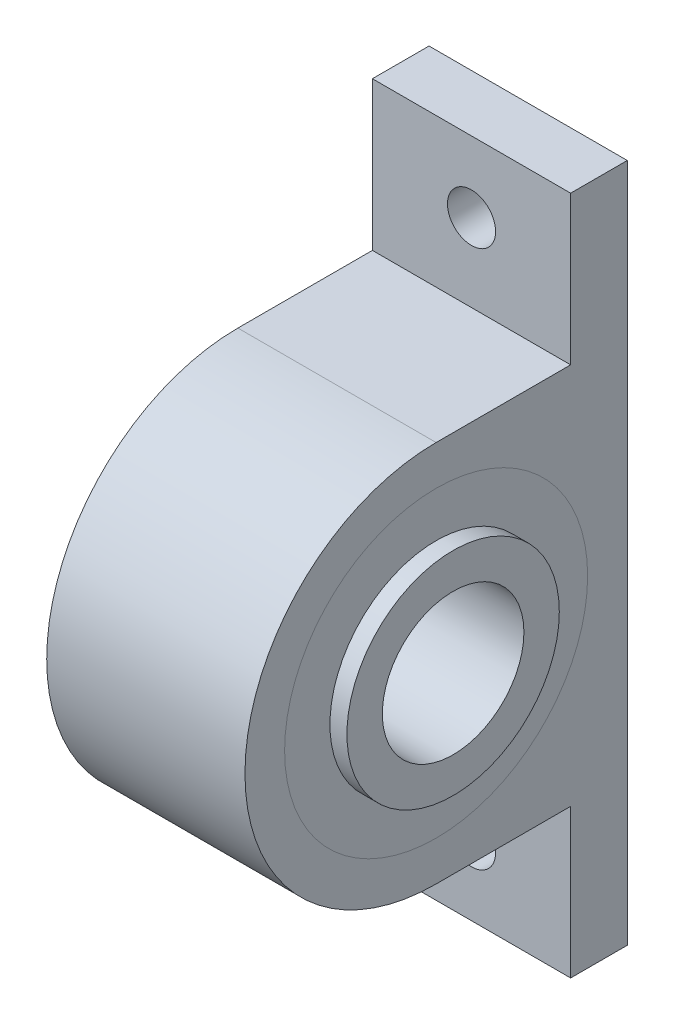
ISO-10303-21;
HEADER;
FILE_DESCRIPTION(('STEP AP214'),'2;1');
FILE_NAME('part.step','',(''),(''),'','','');
FILE_SCHEMA(('AUTOMOTIVE_DESIGN { 1 0 10303 214 1 1 1 1 }'));
ENDSEC;
DATA;
#1=APPLICATION_CONTEXT('core data for automotive mechanical design processes');
#2=APPLICATION_PROTOCOL_DEFINITION('international standard','automotive_design',2000,#1);
#3=PRODUCT_CONTEXT('',#1,'mechanical');
#4=PRODUCT('Part','Part','',(#3));
#5=PRODUCT_RELATED_PRODUCT_CATEGORY('part','',(#4));
#6=PRODUCT_DEFINITION_FORMATION('','',#4);
#7=PRODUCT_DEFINITION_CONTEXT('part definition',#1,'design');
#8=PRODUCT_DEFINITION('design','',#6,#7);
#9=PRODUCT_DEFINITION_SHAPE('','',#8);
#10=(LENGTH_UNIT() NAMED_UNIT(*) SI_UNIT(.MILLI.,.METRE.));
#11=(NAMED_UNIT(*) PLANE_ANGLE_UNIT() SI_UNIT($,.RADIAN.));
#12=(NAMED_UNIT(*) SI_UNIT($,.STERADIAN.) SOLID_ANGLE_UNIT());
#13=UNCERTAINTY_MEASURE_WITH_UNIT(LENGTH_MEASURE(1.E-05),#10,'distance_accuracy_value','');
#14=(GEOMETRIC_REPRESENTATION_CONTEXT(3) GLOBAL_UNCERTAINTY_ASSIGNED_CONTEXT((#13)) GLOBAL_UNIT_ASSIGNED_CONTEXT((#10,
#11,#12)) REPRESENTATION_CONTEXT('',''));
#15=CARTESIAN_POINT('',(0.,0.,0.));
#16=DIRECTION('',(0.,0.,1.));
#17=DIRECTION('',(1.,0.,0.));
#18=AXIS2_PLACEMENT_3D('',#15,#16,#17);
#19=CARTESIAN_POINT('',(-44.9999999999999,0.,67.5));
#20=DIRECTION('',(1.,0.,0.));
#21=DIRECTION('',(0.,0.,-1.));
#22=AXIS2_PLACEMENT_3D('',#19,#20,#21);
#23=CYLINDRICAL_SURFACE('',#22,37.5);
#24=CARTESIAN_POINT('',(-44.9999999999999,0.,67.5));
#25=DIRECTION('',(1.,0.,0.));
#26=DIRECTION('',(0.,0.,-1.));
#27=AXIS2_PLACEMENT_3D('',#24,#25,#26);
#28=CIRCLE('',#27,37.5);
#29=CARTESIAN_POINT('',(-44.9999999999999,0.,30.));
#30=VERTEX_POINT('',#29);
#31=EDGE_CURVE('E11',#30,#30,#28,.T.);
#32=ORIENTED_EDGE('',*,*,#31,.T.);
#33=EDGE_LOOP('',(#32));
#34=FACE_BOUND('',#33,.T.);
#35=CARTESIAN_POINT('',(40.9999999999999,0.,67.5));
#36=DIRECTION('',(1.,0.,0.));
#37=DIRECTION('',(0.,0.,-1.));
#38=AXIS2_PLACEMENT_3D('',#35,#36,#37);
#39=CIRCLE('',#38,37.5);
#40=CARTESIAN_POINT('',(40.9999999999999,0.,30.));
#41=VERTEX_POINT('',#40);
#42=EDGE_CURVE('E49',#41,#41,#39,.T.);
#43=ORIENTED_EDGE('',*,*,#42,.F.);
#44=EDGE_LOOP('',(#43));
#45=FACE_BOUND('',#44,.T.);
#46=ADVANCED_FACE('F39',(#34,#45),#23,.T.);
#47=CARTESIAN_POINT('',(-44.9999999999999,0.,67.5));
#48=DIRECTION('',(1.,0.,0.));
#49=DIRECTION('',(0.,0.,-1.));
#50=AXIS2_PLACEMENT_3D('',#47,#48,#49);
#51=PLANE('',#50);
#52=CARTESIAN_POINT('',(-44.9999999999999,0.,67.5));
#53=DIRECTION('',(1.,0.,0.));
#54=DIRECTION('',(0.,0.,-1.));
#55=AXIS2_PLACEMENT_3D('',#52,#53,#54);
#56=CIRCLE('',#55,25.);
#57=CARTESIAN_POINT('',(-44.9999999999999,0.,42.5));
#58=VERTEX_POINT('',#57);
#59=EDGE_CURVE('E45',#58,#58,#56,.T.);
#60=ORIENTED_EDGE('',*,*,#59,.T.);
#61=EDGE_LOOP('',(#60));
#62=FACE_BOUND('',#61,.T.);
#63=ORIENTED_EDGE('',*,*,#31,.F.);
#64=EDGE_LOOP('',(#63));
#65=FACE_BOUND('',#64,.T.);
#66=ADVANCED_FACE('F68',(#62,#65),#51,.F.);
#67=CARTESIAN_POINT('',(-44.9999999999999,0.,67.5));
#68=DIRECTION('',(1.,0.,0.));
#69=DIRECTION('',(0.,0.,-1.));
#70=AXIS2_PLACEMENT_3D('',#67,#68,#69);
#71=CYLINDRICAL_SURFACE('',#70,25.);
#72=ORIENTED_EDGE('',*,*,#59,.F.);
#73=EDGE_LOOP('',(#72));
#74=FACE_BOUND('',#73,.T.);
#75=CARTESIAN_POINT('',(40.9999999999999,0.,67.5));
#76=DIRECTION('',(1.,0.,0.));
#77=DIRECTION('',(0.,0.,-1.));
#78=AXIS2_PLACEMENT_3D('',#75,#76,#77);
#79=CIRCLE('',#78,25.);
#80=CARTESIAN_POINT('',(40.9999999999999,0.,42.5));
#81=VERTEX_POINT('',#80);
#82=EDGE_CURVE('E53',#81,#81,#79,.T.);
#83=ORIENTED_EDGE('',*,*,#82,.T.);
#84=EDGE_LOOP('',(#83));
#85=FACE_BOUND('',#84,.T.);
#86=ADVANCED_FACE('F59',(#74,#85),#71,.F.);
#87=CARTESIAN_POINT('',(40.9999999999999,0.,67.5));
#88=DIRECTION('',(1.,0.,0.));
#89=DIRECTION('',(0.,0.,-1.));
#90=AXIS2_PLACEMENT_3D('',#87,#88,#89);
#91=PLANE('',#90);
#92=ORIENTED_EDGE('',*,*,#42,.T.);
#93=EDGE_LOOP('',(#92));
#94=FACE_BOUND('',#93,.T.);
#95=ORIENTED_EDGE('',*,*,#82,.F.);
#96=EDGE_LOOP('',(#95));
#97=FACE_BOUND('',#96,.T.);
#98=ADVANCED_FACE('F61',(#94,#97),#91,.T.);
#99=CLOSED_SHELL('',(#46,#66,#86,#98));
#100=MANIFOLD_SOLID_BREP('B2',#99);
#101=CARTESIAN_POINT('',(-186.320851173921,0.,67.5));
#102=DIRECTION('',(1.,0.,0.));
#103=DIRECTION('',(0.,0.,-1.));
#104=AXIS2_PLACEMENT_3D('',#101,#102,#103);
#105=CYLINDRICAL_SURFACE('',#104,53.5);
#106=CARTESIAN_POINT('',(-35.,0.,67.5));
#107=DIRECTION('',(1.,0.,0.));
#108=DIRECTION('',(0.,0.,-1.));
#109=AXIS2_PLACEMENT_3D('',#106,#107,#108);
#110=CIRCLE('',#109,53.5);
#111=CARTESIAN_POINT('',(-35.,0.,14.));
#112=VERTEX_POINT('',#111);
#113=EDGE_CURVE('E115',#112,#112,#110,.F.);
#114=ORIENTED_EDGE('',*,*,#113,.F.);
#115=EDGE_LOOP('',(#114));
#116=FACE_BOUND('',#115,.T.);
#117=CARTESIAN_POINT('',(35.,0.,67.5));
#118=DIRECTION('',(1.,0.,0.));
#119=DIRECTION('',(0.,0.,-1.));
#120=AXIS2_PLACEMENT_3D('',#117,#118,#119);
#121=CIRCLE('',#120,53.5);
#122=CARTESIAN_POINT('',(35.,0.,14.));
#123=VERTEX_POINT('',#122);
#124=EDGE_CURVE('E119',#123,#123,#121,.T.);
#125=ORIENTED_EDGE('',*,*,#124,.F.);
#126=EDGE_LOOP('',(#125));
#127=FACE_BOUND('',#126,.T.);
#128=ADVANCED_FACE('F109',(#116,#127),#105,.T.);
#129=CARTESIAN_POINT('',(35.,0.,67.5));
#130=DIRECTION('',(1.,0.,0.));
#131=DIRECTION('',(0.,0.,-1.));
#132=AXIS2_PLACEMENT_3D('',#129,#130,#131);
#133=PLANE('',#132);
#134=CARTESIAN_POINT('',(35.,0.,67.5));
#135=DIRECTION('',(1.,0.,0.));
#136=DIRECTION('',(0.,0.,-1.));
#137=AXIS2_PLACEMENT_3D('',#134,#135,#136);
#138=CIRCLE('',#137,37.5);
#139=CARTESIAN_POINT('',(35.,0.,30.));
#140=VERTEX_POINT('',#139);
#141=EDGE_CURVE('E124',#140,#140,#138,.T.);
#142=ORIENTED_EDGE('',*,*,#141,.F.);
#143=EDGE_LOOP('',(#142));
#144=FACE_BOUND('',#143,.T.);
#145=ORIENTED_EDGE('',*,*,#124,.T.);
#146=EDGE_LOOP('',(#145));
#147=FACE_BOUND('',#146,.T.);
#148=ADVANCED_FACE('F131',(#144,#147),#133,.T.);
#149=CARTESIAN_POINT('',(-186.320851173921,0.,67.5));
#150=DIRECTION('',(1.,0.,0.));
#151=DIRECTION('',(0.,0.,-1.));
#152=AXIS2_PLACEMENT_3D('',#149,#150,#151);
#153=CYLINDRICAL_SURFACE('',#152,37.5);
#154=CARTESIAN_POINT('',(-35.,0.,67.5));
#155=DIRECTION('',(1.,0.,0.));
#156=DIRECTION('',(0.,0.,-1.));
#157=AXIS2_PLACEMENT_3D('',#154,#155,#156);
#158=CIRCLE('',#157,37.5);
#159=CARTESIAN_POINT('',(-35.,0.,30.));
#160=VERTEX_POINT('',#159);
#161=EDGE_CURVE('E38',#160,#160,#158,.F.);
#162=ORIENTED_EDGE('',*,*,#161,.T.);
#163=EDGE_LOOP('',(#162));
#164=FACE_BOUND('',#163,.T.);
#165=ORIENTED_EDGE('',*,*,#141,.T.);
#166=EDGE_LOOP('',(#165));
#167=FACE_BOUND('',#166,.T.);
#168=ADVANCED_FACE('F129',(#164,#167),#153,.F.);
#169=CARTESIAN_POINT('',(-35.,-120.,20.));
#170=DIRECTION('',(1.,0.,0.));
#171=DIRECTION('',(0.,0.,-1.));
#172=AXIS2_PLACEMENT_3D('',#169,#170,#171);
#173=PLANE('',#172);
#174=ORIENTED_EDGE('',*,*,#113,.T.);
#175=EDGE_LOOP('',(#174));
#176=FACE_BOUND('',#175,.T.);
#177=ORIENTED_EDGE('',*,*,#161,.F.);
#178=EDGE_LOOP('',(#177));
#179=FACE_BOUND('',#178,.T.);
#180=ADVANCED_FACE('F150',(#176,#179),#173,.F.);
#181=CLOSED_SHELL('',(#128,#148,#168,#180));
#182=MANIFOLD_SOLID_BREP('B6',#181);
#183=CARTESIAN_POINT('',(0.,0.,20.));
#184=DIRECTION('',(0.,0.,-1.));
#185=DIRECTION('',(-1.,0.,0.));
#186=AXIS2_PLACEMENT_3D('',#183,#184,#185);
#187=PLANE('',#186);
#188=CARTESIAN_POINT('',(0.,-95.,20.));
#189=DIRECTION('',(0.,0.,1.));
#190=DIRECTION('',(1.,0.,0.));
#191=AXIS2_PLACEMENT_3D('',#188,#189,#190);
#192=CIRCLE('',#191,8.5);
#193=CARTESIAN_POINT('',(8.5,-95.,20.));
#194=VERTEX_POINT('',#193);
#195=EDGE_CURVE('E289',#194,#194,#192,.T.);
#196=ORIENTED_EDGE('',*,*,#195,.F.);
#197=EDGE_LOOP('',(#196));
#198=FACE_BOUND('',#197,.T.);
#199=DIRECTION('',(-1.,0.,0.));
#200=VECTOR('',#199,1.);
#201=CARTESIAN_POINT('',(86.362704791783,-67.5,20.));
#202=LINE('',#201,#200);
#203=CARTESIAN_POINT('',(35.,-67.5,20.));
#204=VERTEX_POINT('',#203);
#205=CARTESIAN_POINT('',(-35.,-67.5,20.));
#206=VERTEX_POINT('',#205);
#207=EDGE_CURVE('E241',#204,#206,#202,.T.);
#208=ORIENTED_EDGE('',*,*,#207,.T.);
#209=DIRECTION('',(0.,-1.,0.));
#210=VECTOR('',#209,1.);
#211=CARTESIAN_POINT('',(-35.,-120.,20.));
#212=LINE('',#211,#210);
#213=CARTESIAN_POINT('',(-35.,-120.,20.));
#214=VERTEX_POINT('',#213);
#215=EDGE_CURVE('E251',#206,#214,#212,.T.);
#216=ORIENTED_EDGE('',*,*,#215,.T.);
#217=DIRECTION('',(1.,0.,0.));
#218=VECTOR('',#217,1.);
#219=CARTESIAN_POINT('',(-35.,-120.,20.));
#220=LINE('',#219,#218);
#221=CARTESIAN_POINT('',(35.,-120.,20.));
#222=VERTEX_POINT('',#221);
#223=EDGE_CURVE('E263',#214,#222,#220,.T.);
#224=ORIENTED_EDGE('',*,*,#223,.T.);
#225=DIRECTION('',(0.,1.,0.));
#226=VECTOR('',#225,1.);
#227=CARTESIAN_POINT('',(35.,-120.,20.));
#228=LINE('',#227,#226);
#229=EDGE_CURVE('E254',#222,#204,#228,.T.);
#230=ORIENTED_EDGE('',*,*,#229,.T.);
#231=EDGE_LOOP('',(#208,#216,#224,#230));
#232=FACE_BOUND('',#231,.T.);
#233=ADVANCED_FACE('F170',(#198,#232),#187,.F.);
#234=CARTESIAN_POINT('',(225.918830920368,0.,67.5));
#235=DIRECTION('',(-1.,0.,0.));
#236=DIRECTION('',(0.,0.,1.));
#237=AXIS2_PLACEMENT_3D('',#234,#235,#236);
#238=CYLINDRICAL_SURFACE('',#237,67.5);
#239=CARTESIAN_POINT('',(35.,0.,67.5));
#240=DIRECTION('',(-1.,0.,0.));
#241=DIRECTION('',(0.,0.,1.));
#242=AXIS2_PLACEMENT_3D('',#239,#240,#241);
#243=CIRCLE('',#242,67.5);
#244=CARTESIAN_POINT('',(35.,-67.5,67.4999999999993));
#245=VERTEX_POINT('',#244);
#246=CARTESIAN_POINT('',(35.,67.5,67.5));
#247=VERTEX_POINT('',#246);
#248=EDGE_CURVE('E187',#245,#247,#243,.T.);
#249=ORIENTED_EDGE('',*,*,#248,.T.);
#250=DIRECTION('',(-1.,0.,0.));
#251=VECTOR('',#250,1.);
#252=CARTESIAN_POINT('',(86.362704791783,67.5,67.5000000000002));
#253=LINE('',#252,#251);
#254=CARTESIAN_POINT('',(-35.,67.5,67.5));
#255=VERTEX_POINT('',#254);
#256=EDGE_CURVE('E304',#247,#255,#253,.T.);
#257=ORIENTED_EDGE('',*,*,#256,.T.);
#258=CARTESIAN_POINT('',(-35.,0.,67.5));
#259=DIRECTION('',(1.,0.,0.));
#260=DIRECTION('',(0.,0.,-1.));
#261=AXIS2_PLACEMENT_3D('',#258,#259,#260);
#262=CIRCLE('',#261,67.5);
#263=CARTESIAN_POINT('',(-35.,-67.5,67.5));
#264=VERTEX_POINT('',#263);
#265=EDGE_CURVE('E309',#264,#255,#262,.F.);
#266=ORIENTED_EDGE('',*,*,#265,.F.);
#267=DIRECTION('',(-1.,0.,0.));
#268=VECTOR('',#267,1.);
#269=CARTESIAN_POINT('',(86.362704791783,-67.5,67.4999999999993));
#270=LINE('',#269,#268);
#271=EDGE_CURVE('E243',#245,#264,#270,.T.);
#272=ORIENTED_EDGE('',*,*,#271,.F.);
#273=EDGE_LOOP('',(#249,#257,#266,#272));
#274=FACE_BOUND('',#273,.T.);
#275=ADVANCED_FACE('F333',(#274),#238,.T.);
#276=CARTESIAN_POINT('',(0.,95.,20.));
#277=DIRECTION('',(0.,0.,1.));
#278=DIRECTION('',(1.,0.,0.));
#279=AXIS2_PLACEMENT_3D('',#276,#277,#278);
#280=CIRCLE('',#279,8.50000000000001);
#281=CARTESIAN_POINT('',(8.50000000000001,95.,20.));
#282=VERTEX_POINT('',#281);
#283=EDGE_CURVE('E299',#282,#282,#280,.T.);
#284=ORIENTED_EDGE('',*,*,#283,.F.);
#285=EDGE_LOOP('',(#284));
#286=FACE_BOUND('',#285,.T.);
#287=CARTESIAN_POINT('',(-35.,120.,20.));
#288=VERTEX_POINT('',#287);
#289=CARTESIAN_POINT('',(-35.,67.5,20.));
#290=VERTEX_POINT('',#289);
#291=EDGE_CURVE('E260',#288,#290,#212,.T.);
#292=ORIENTED_EDGE('',*,*,#291,.T.);
#293=DIRECTION('',(-1.,0.,0.));
#294=VECTOR('',#293,1.);
#295=CARTESIAN_POINT('',(86.362704791783,67.5,20.));
#296=LINE('',#295,#294);
#297=CARTESIAN_POINT('',(35.,67.5,20.));
#298=VERTEX_POINT('',#297);
#299=EDGE_CURVE('E195',#298,#290,#296,.T.);
#300=ORIENTED_EDGE('',*,*,#299,.F.);
#301=CARTESIAN_POINT('',(35.,120.,20.));
#302=VERTEX_POINT('',#301);
#303=EDGE_CURVE('E277',#298,#302,#228,.T.);
#304=ORIENTED_EDGE('',*,*,#303,.T.);
#305=DIRECTION('',(-1.,0.,0.));
#306=VECTOR('',#305,1.);
#307=CARTESIAN_POINT('',(-35.,120.,20.));
#308=LINE('',#307,#306);
#309=EDGE_CURVE('E261',#302,#288,#308,.T.);
#310=ORIENTED_EDGE('',*,*,#309,.T.);
#311=EDGE_LOOP('',(#292,#300,#304,#310));
#312=FACE_BOUND('',#311,.T.);
#313=ADVANCED_FACE('F314',(#286,#312),#187,.F.);
#314=CARTESIAN_POINT('',(35.,-120.,20.));
#315=DIRECTION('',(-1.,0.,0.));
#316=DIRECTION('',(0.,0.,1.));
#317=AXIS2_PLACEMENT_3D('',#314,#315,#316);
#318=PLANE('',#317);
#319=CARTESIAN_POINT('',(35.,0.,67.5));
#320=DIRECTION('',(1.,0.,0.));
#321=DIRECTION('',(0.,0.,-1.));
#322=AXIS2_PLACEMENT_3D('',#319,#320,#321);
#323=CIRCLE('',#322,53.5);
#324=CARTESIAN_POINT('',(35.,0.,14.));
#325=VERTEX_POINT('',#324);
#326=EDGE_CURVE('E286',#325,#325,#323,.T.);
#327=ORIENTED_EDGE('',*,*,#326,.F.);
#328=EDGE_LOOP('',(#327));
#329=FACE_BOUND('',#328,.T.);
#330=DIRECTION('',(0.,0.,1.));
#331=VECTOR('',#330,1.);
#332=CARTESIAN_POINT('',(35.,-67.5,0.));
#333=LINE('',#332,#331);
#334=EDGE_CURVE('E308',#204,#245,#333,.T.);
#335=ORIENTED_EDGE('',*,*,#334,.F.);
#336=ORIENTED_EDGE('',*,*,#229,.F.);
#337=DIRECTION('',(0.,0.,-1.));
#338=VECTOR('',#337,1.);
#339=CARTESIAN_POINT('',(35.,-120.,20.));
#340=LINE('',#339,#338);
#341=CARTESIAN_POINT('',(35.,-120.,0.));
#342=VERTEX_POINT('',#341);
#343=EDGE_CURVE('E268',#222,#342,#340,.T.);
#344=ORIENTED_EDGE('',*,*,#343,.T.);
#345=DIRECTION('',(0.,1.,0.));
#346=VECTOR('',#345,1.);
#347=CARTESIAN_POINT('',(35.,-120.,0.));
#348=LINE('',#347,#346);
#349=CARTESIAN_POINT('',(35.,120.,0.));
#350=VERTEX_POINT('',#349);
#351=EDGE_CURVE('E269',#342,#350,#348,.T.);
#352=ORIENTED_EDGE('',*,*,#351,.T.);
#353=DIRECTION('',(0.,0.,-1.));
#354=VECTOR('',#353,1.);
#355=CARTESIAN_POINT('',(35.,120.,20.));
#356=LINE('',#355,#354);
#357=EDGE_CURVE('E107',#302,#350,#356,.T.);
#358=ORIENTED_EDGE('',*,*,#357,.F.);
#359=ORIENTED_EDGE('',*,*,#303,.F.);
#360=DIRECTION('',(0.,0.,1.));
#361=VECTOR('',#360,1.);
#362=CARTESIAN_POINT('',(35.,67.5,0.));
#363=LINE('',#362,#361);
#364=EDGE_CURVE('E248',#298,#247,#363,.T.);
#365=ORIENTED_EDGE('',*,*,#364,.T.);
#366=ORIENTED_EDGE('',*,*,#248,.F.);
#367=EDGE_LOOP('',(#335,#336,#344,#352,#358,#359,#365,#366));
#368=FACE_BOUND('',#367,.T.);
#369=ADVANCED_FACE('F172',(#329,#368),#318,.F.);
#370=CARTESIAN_POINT('',(-35.,120.,20.));
#371=DIRECTION('',(0.,-1.,0.));
#372=DIRECTION('',(0.,0.,-1.));
#373=AXIS2_PLACEMENT_3D('',#370,#371,#372);
#374=PLANE('',#373);
#375=DIRECTION('',(-1.,0.,0.));
#376=VECTOR('',#375,1.);
#377=CARTESIAN_POINT('',(-35.,120.,0.));
#378=LINE('',#377,#376);
#379=CARTESIAN_POINT('',(-35.,120.,0.));
#380=VERTEX_POINT('',#379);
#381=EDGE_CURVE('E271',#350,#380,#378,.T.);
#382=ORIENTED_EDGE('',*,*,#381,.T.);
#383=DIRECTION('',(0.,0.,-1.));
#384=VECTOR('',#383,1.);
#385=CARTESIAN_POINT('',(-35.,120.,20.));
#386=LINE('',#385,#384);
#387=EDGE_CURVE('E179',#288,#380,#386,.T.);
#388=ORIENTED_EDGE('',*,*,#387,.F.);
#389=ORIENTED_EDGE('',*,*,#309,.F.);
#390=ORIENTED_EDGE('',*,*,#357,.T.);
#391=EDGE_LOOP('',(#382,#388,#389,#390));
#392=FACE_BOUND('',#391,.T.);
#393=ADVANCED_FACE('F320',(#392),#374,.F.);
#394=CARTESIAN_POINT('',(-35.,-120.,20.));
#395=DIRECTION('',(1.,0.,0.));
#396=DIRECTION('',(0.,0.,-1.));
#397=AXIS2_PLACEMENT_3D('',#394,#395,#396);
#398=PLANE('',#397);
#399=CARTESIAN_POINT('',(-35.,0.,67.5));
#400=DIRECTION('',(1.,0.,0.));
#401=DIRECTION('',(0.,0.,-1.));
#402=AXIS2_PLACEMENT_3D('',#399,#400,#401);
#403=CIRCLE('',#402,53.5);
#404=CARTESIAN_POINT('',(-35.,0.,14.));
#405=VERTEX_POINT('',#404);
#406=EDGE_CURVE('E283',#405,#405,#403,.T.);
#407=ORIENTED_EDGE('',*,*,#406,.T.);
#408=EDGE_LOOP('',(#407));
#409=FACE_BOUND('',#408,.T.);
#410=ORIENTED_EDGE('',*,*,#215,.F.);
#411=DIRECTION('',(0.,0.,1.));
#412=VECTOR('',#411,1.);
#413=CARTESIAN_POINT('',(-35.,-67.5,0.));
#414=LINE('',#413,#412);
#415=EDGE_CURVE('E238',#206,#264,#414,.T.);
#416=ORIENTED_EDGE('',*,*,#415,.T.);
#417=ORIENTED_EDGE('',*,*,#265,.T.);
#418=DIRECTION('',(0.,0.,1.));
#419=VECTOR('',#418,1.);
#420=CARTESIAN_POINT('',(-35.,67.5,0.));
#421=LINE('',#420,#419);
#422=EDGE_CURVE('E285',#290,#255,#421,.T.);
#423=ORIENTED_EDGE('',*,*,#422,.F.);
#424=ORIENTED_EDGE('',*,*,#291,.F.);
#425=ORIENTED_EDGE('',*,*,#387,.T.);
#426=DIRECTION('',(0.,-1.,0.));
#427=VECTOR('',#426,1.);
#428=CARTESIAN_POINT('',(-35.,-120.,0.));
#429=LINE('',#428,#427);
#430=CARTESIAN_POINT('',(-35.,-120.,0.));
#431=VERTEX_POINT('',#430);
#432=EDGE_CURVE('E273',#380,#431,#429,.T.);
#433=ORIENTED_EDGE('',*,*,#432,.T.);
#434=DIRECTION('',(0.,0.,-1.));
#435=VECTOR('',#434,1.);
#436=CARTESIAN_POINT('',(-35.,-120.,20.));
#437=LINE('',#436,#435);
#438=EDGE_CURVE('E258',#214,#431,#437,.T.);
#439=ORIENTED_EDGE('',*,*,#438,.F.);
#440=EDGE_LOOP('',(#410,#416,#417,#423,#424,#425,#433,#439));
#441=FACE_BOUND('',#440,.T.);
#442=ADVANCED_FACE('F256',(#409,#441),#398,.F.);
#443=CARTESIAN_POINT('',(-35.,-120.,20.));
#444=DIRECTION('',(0.,1.,0.));
#445=DIRECTION('',(0.,0.,1.));
#446=AXIS2_PLACEMENT_3D('',#443,#444,#445);
#447=PLANE('',#446);
#448=DIRECTION('',(1.,0.,0.));
#449=VECTOR('',#448,1.);
#450=CARTESIAN_POINT('',(-35.,-120.,0.));
#451=LINE('',#450,#449);
#452=EDGE_CURVE('E275',#431,#342,#451,.T.);
#453=ORIENTED_EDGE('',*,*,#452,.T.);
#454=ORIENTED_EDGE('',*,*,#343,.F.);
#455=ORIENTED_EDGE('',*,*,#223,.F.);
#456=ORIENTED_EDGE('',*,*,#438,.T.);
#457=EDGE_LOOP('',(#453,#454,#455,#456));
#458=FACE_BOUND('',#457,.T.);
#459=ADVANCED_FACE('F348',(#458),#447,.F.);
#460=CARTESIAN_POINT('',(0.,0.,0.));
#461=DIRECTION('',(0.,0.,-1.));
#462=DIRECTION('',(-1.,0.,0.));
#463=AXIS2_PLACEMENT_3D('',#460,#461,#462);
#464=PLANE('',#463);
#465=CARTESIAN_POINT('',(0.,95.,0.));
#466=DIRECTION('',(0.,0.,-1.));
#467=DIRECTION('',(-1.,0.,0.));
#468=AXIS2_PLACEMENT_3D('',#465,#466,#467);
#469=CIRCLE('',#468,8.50000000000001);
#470=CARTESIAN_POINT('',(-8.50000000000001,95.,0.));
#471=VERTEX_POINT('',#470);
#472=EDGE_CURVE('E174',#471,#471,#469,.T.);
#473=ORIENTED_EDGE('',*,*,#472,.F.);
#474=EDGE_LOOP('',(#473));
#475=FACE_BOUND('',#474,.T.);
#476=CARTESIAN_POINT('',(0.,-95.,0.));
#477=DIRECTION('',(0.,0.,-1.));
#478=DIRECTION('',(-1.,0.,0.));
#479=AXIS2_PLACEMENT_3D('',#476,#477,#478);
#480=CIRCLE('',#479,8.5);
#481=CARTESIAN_POINT('',(-8.5,-95.,0.));
#482=VERTEX_POINT('',#481);
#483=EDGE_CURVE('E287',#482,#482,#480,.T.);
#484=ORIENTED_EDGE('',*,*,#483,.F.);
#485=EDGE_LOOP('',(#484));
#486=FACE_BOUND('',#485,.T.);
#487=ORIENTED_EDGE('',*,*,#381,.F.);
#488=ORIENTED_EDGE('',*,*,#351,.F.);
#489=ORIENTED_EDGE('',*,*,#452,.F.);
#490=ORIENTED_EDGE('',*,*,#432,.F.);
#491=EDGE_LOOP('',(#487,#488,#489,#490));
#492=FACE_BOUND('',#491,.T.);
#493=ADVANCED_FACE('F328',(#475,#486,#492),#464,.T.);
#494=CARTESIAN_POINT('',(86.362704791783,-67.5,0.));
#495=DIRECTION('',(0.,1.,0.));
#496=DIRECTION('',(0.,0.,1.));
#497=AXIS2_PLACEMENT_3D('',#494,#495,#496);
#498=PLANE('',#497);
#499=ORIENTED_EDGE('',*,*,#207,.F.);
#500=ORIENTED_EDGE('',*,*,#334,.T.);
#501=ORIENTED_EDGE('',*,*,#271,.T.);
#502=ORIENTED_EDGE('',*,*,#415,.F.);
#503=EDGE_LOOP('',(#499,#500,#501,#502));
#504=FACE_BOUND('',#503,.T.);
#505=ADVANCED_FACE('F240',(#504),#498,.F.);
#506=CARTESIAN_POINT('',(86.362704791783,67.5,0.));
#507=DIRECTION('',(0.,1.,0.));
#508=DIRECTION('',(0.,0.,1.));
#509=AXIS2_PLACEMENT_3D('',#506,#507,#508);
#510=PLANE('',#509);
#511=ORIENTED_EDGE('',*,*,#364,.F.);
#512=ORIENTED_EDGE('',*,*,#299,.T.);
#513=ORIENTED_EDGE('',*,*,#422,.T.);
#514=ORIENTED_EDGE('',*,*,#256,.F.);
#515=EDGE_LOOP('',(#511,#512,#513,#514));
#516=FACE_BOUND('',#515,.T.);
#517=ADVANCED_FACE('F331',(#516),#510,.T.);
#518=CARTESIAN_POINT('',(-181.,0.,67.5));
#519=DIRECTION('',(1.,0.,0.));
#520=DIRECTION('',(0.,0.,-1.));
#521=AXIS2_PLACEMENT_3D('',#518,#519,#520);
#522=CYLINDRICAL_SURFACE('',#521,53.5);
#523=ORIENTED_EDGE('',*,*,#326,.T.);
#524=EDGE_LOOP('',(#523));
#525=FACE_BOUND('',#524,.T.);
#526=ORIENTED_EDGE('',*,*,#406,.F.);
#527=EDGE_LOOP('',(#526));
#528=FACE_BOUND('',#527,.T.);
#529=ADVANCED_FACE('F364',(#525,#528),#522,.F.);
#530=CARTESIAN_POINT('',(0.,-95.,-37.9999999999999));
#531=DIRECTION('',(0.,0.,1.));
#532=DIRECTION('',(1.,0.,0.));
#533=AXIS2_PLACEMENT_3D('',#530,#531,#532);
#534=CYLINDRICAL_SURFACE('',#533,8.5);
#535=ORIENTED_EDGE('',*,*,#483,.T.);
#536=EDGE_LOOP('',(#535));
#537=FACE_BOUND('',#536,.T.);
#538=ORIENTED_EDGE('',*,*,#195,.T.);
#539=EDGE_LOOP('',(#538));
#540=FACE_BOUND('',#539,.T.);
#541=ADVANCED_FACE('F367',(#537,#540),#534,.F.);
#542=CARTESIAN_POINT('',(0.,95.,-37.9999999999999));
#543=DIRECTION('',(0.,0.,1.));
#544=DIRECTION('',(1.,0.,0.));
#545=AXIS2_PLACEMENT_3D('',#542,#543,#544);
#546=CYLINDRICAL_SURFACE('',#545,8.50000000000001);
#547=ORIENTED_EDGE('',*,*,#472,.T.);
#548=EDGE_LOOP('',(#547));
#549=FACE_BOUND('',#548,.T.);
#550=ORIENTED_EDGE('',*,*,#283,.T.);
#551=EDGE_LOOP('',(#550));
#552=FACE_BOUND('',#551,.T.);
#553=ADVANCED_FACE('F374',(#549,#552),#546,.F.);
#554=CLOSED_SHELL('',(#233,#275,#313,#369,#393,#442,#459,#493,#505,#517,#529,#541,#553));
#555=MANIFOLD_SOLID_BREP('B33',#554);
#556=ADVANCED_BREP_SHAPE_REPRESENTATION('',(#18,#100,#182,#555),#14);
#557=SHAPE_DEFINITION_REPRESENTATION(#9,#556);
ENDSEC;
END-ISO-10303-21;
